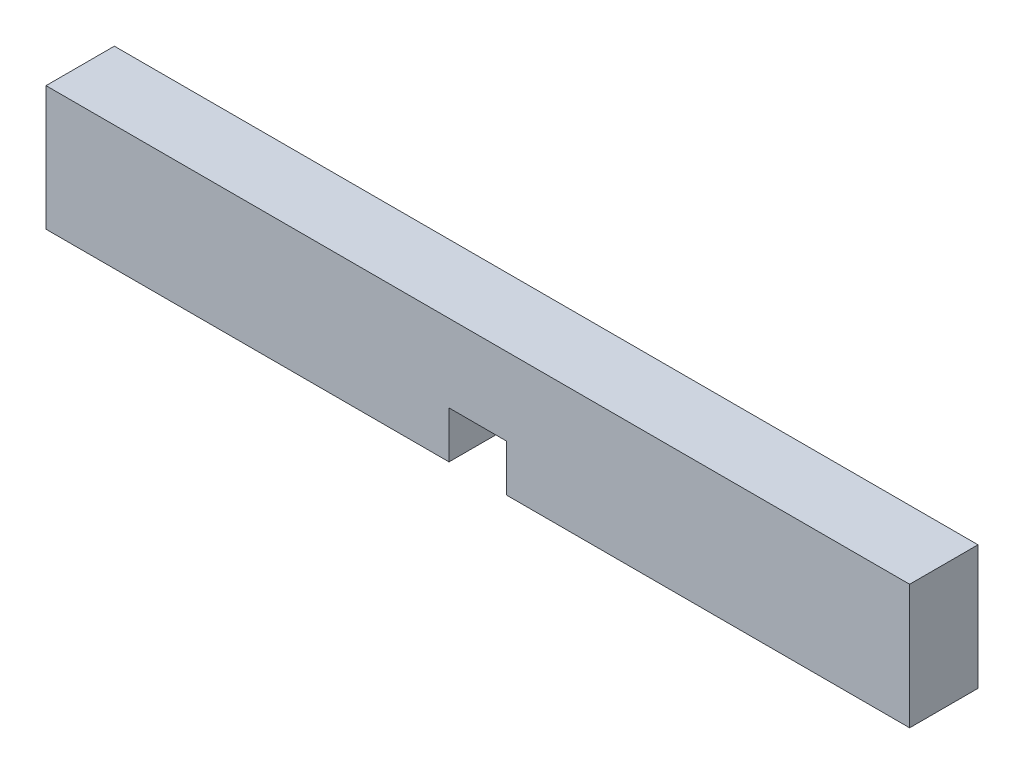
ISO-10303-21;
HEADER;
FILE_DESCRIPTION(('STEP AP214'),'2;1');
FILE_NAME('part.step','',(''),(''),'','','');
FILE_SCHEMA(('AUTOMOTIVE_DESIGN { 1 0 10303 214 1 1 1 1 }'));
ENDSEC;
DATA;
#1=APPLICATION_CONTEXT('core data for automotive mechanical design processes');
#2=APPLICATION_PROTOCOL_DEFINITION('international standard','automotive_design',2000,#1);
#3=PRODUCT_CONTEXT('',#1,'mechanical');
#4=PRODUCT('Part','Part','',(#3));
#5=PRODUCT_RELATED_PRODUCT_CATEGORY('part','',(#4));
#6=PRODUCT_DEFINITION_FORMATION('','',#4);
#7=PRODUCT_DEFINITION_CONTEXT('part definition',#1,'design');
#8=PRODUCT_DEFINITION('design','',#6,#7);
#9=PRODUCT_DEFINITION_SHAPE('','',#8);
#10=(LENGTH_UNIT() NAMED_UNIT(*) SI_UNIT(.MILLI.,.METRE.));
#11=(NAMED_UNIT(*) PLANE_ANGLE_UNIT() SI_UNIT($,.RADIAN.));
#12=(NAMED_UNIT(*) SI_UNIT($,.STERADIAN.) SOLID_ANGLE_UNIT());
#13=UNCERTAINTY_MEASURE_WITH_UNIT(LENGTH_MEASURE(1.E-05),#10,'distance_accuracy_value','');
#14=(GEOMETRIC_REPRESENTATION_CONTEXT(3) GLOBAL_UNCERTAINTY_ASSIGNED_CONTEXT((#13)) GLOBAL_UNIT_ASSIGNED_CONTEXT((#10,
#11,#12)) REPRESENTATION_CONTEXT('',''));
#15=CARTESIAN_POINT('',(0.,0.,0.));
#16=DIRECTION('',(0.,0.,1.));
#17=DIRECTION('',(1.,0.,0.));
#18=AXIS2_PLACEMENT_3D('',#15,#16,#17);
#19=CARTESIAN_POINT('',(0.,-1.07,2.375));
#20=DIRECTION('',(0.,1.,0.));
#21=DIRECTION('',(0.,0.,1.));
#22=AXIS2_PLACEMENT_3D('',#19,#20,#21);
#23=PLANE('',#22);
#24=DIRECTION('',(1.,0.,0.));
#25=VECTOR('',#24,1.);
#26=CARTESIAN_POINT('',(0.,-1.07,-2.375));
#27=LINE('',#26,#25);
#28=CARTESIAN_POINT('',(-2.,-1.07,-2.375));
#29=VERTEX_POINT('',#28);
#30=CARTESIAN_POINT('',(2.,-1.07,-2.375));
#31=VERTEX_POINT('',#30);
#32=EDGE_CURVE('E134',#29,#31,#27,.T.);
#33=ORIENTED_EDGE('',*,*,#32,.T.);
#34=DIRECTION('',(0.,0.,-1.));
#35=VECTOR('',#34,1.);
#36=CARTESIAN_POINT('',(2.,-1.07,2.375));
#37=LINE('',#36,#35);
#38=CARTESIAN_POINT('',(2.,-1.07,2.375));
#39=VERTEX_POINT('',#38);
#40=EDGE_CURVE('E11',#39,#31,#37,.T.);
#41=ORIENTED_EDGE('',*,*,#40,.F.);
#42=DIRECTION('',(1.,0.,0.));
#43=VECTOR('',#42,1.);
#44=CARTESIAN_POINT('',(0.,-1.07,2.375));
#45=LINE('',#44,#43);
#46=CARTESIAN_POINT('',(-2.,-1.07,2.375));
#47=VERTEX_POINT('',#46);
#48=EDGE_CURVE('E151',#47,#39,#45,.T.);
#49=ORIENTED_EDGE('',*,*,#48,.F.);
#50=DIRECTION('',(0.,0.,-1.));
#51=VECTOR('',#50,1.);
#52=CARTESIAN_POINT('',(-2.,-1.07,2.375));
#53=LINE('',#52,#51);
#54=EDGE_CURVE('E51',#47,#29,#53,.T.);
#55=ORIENTED_EDGE('',*,*,#54,.T.);
#56=EDGE_LOOP('',(#33,#41,#49,#55));
#57=FACE_BOUND('',#56,.T.);
#58=ADVANCED_FACE('F35',(#57),#23,.F.);
#59=CARTESIAN_POINT('',(2.,0.,2.375));
#60=DIRECTION('',(1.,0.,0.));
#61=DIRECTION('',(0.,0.,-1.));
#62=AXIS2_PLACEMENT_3D('',#59,#60,#61);
#63=PLANE('',#62);
#64=DIRECTION('',(0.,-1.,0.));
#65=VECTOR('',#64,1.);
#66=CARTESIAN_POINT('',(2.,0.,-2.375));
#67=LINE('',#66,#65);
#68=CARTESIAN_POINT('',(2.,-4.32,-2.375));
#69=VERTEX_POINT('',#68);
#70=EDGE_CURVE('E136',#31,#69,#67,.T.);
#71=ORIENTED_EDGE('',*,*,#70,.T.);
#72=DIRECTION('',(0.,0.,-1.));
#73=VECTOR('',#72,1.);
#74=CARTESIAN_POINT('',(2.,-4.32,2.375));
#75=LINE('',#74,#73);
#76=CARTESIAN_POINT('',(2.,-4.32,2.375));
#77=VERTEX_POINT('',#76);
#78=EDGE_CURVE('E43',#77,#69,#75,.T.);
#79=ORIENTED_EDGE('',*,*,#78,.F.);
#80=DIRECTION('',(0.,-1.,0.));
#81=VECTOR('',#80,1.);
#82=CARTESIAN_POINT('',(2.,0.,2.375));
#83=LINE('',#82,#81);
#84=EDGE_CURVE('E90',#39,#77,#83,.T.);
#85=ORIENTED_EDGE('',*,*,#84,.F.);
#86=ORIENTED_EDGE('',*,*,#40,.T.);
#87=EDGE_LOOP('',(#71,#79,#85,#86));
#88=FACE_BOUND('',#87,.T.);
#89=ADVANCED_FACE('F176',(#88),#63,.F.);
#90=CARTESIAN_POINT('',(0.,-4.32,2.375));
#91=DIRECTION('',(0.,1.,0.));
#92=DIRECTION('',(0.,0.,1.));
#93=AXIS2_PLACEMENT_3D('',#90,#91,#92);
#94=PLANE('',#93);
#95=DIRECTION('',(1.,0.,0.));
#96=VECTOR('',#95,1.);
#97=CARTESIAN_POINT('',(0.,-4.32,-2.375));
#98=LINE('',#97,#96);
#99=CARTESIAN_POINT('',(30.,-4.32,-2.375));
#100=VERTEX_POINT('',#99);
#101=EDGE_CURVE('E138',#69,#100,#98,.T.);
#102=ORIENTED_EDGE('',*,*,#101,.T.);
#103=DIRECTION('',(0.,0.,-1.));
#104=VECTOR('',#103,1.);
#105=CARTESIAN_POINT('',(30.,-4.32,2.375));
#106=LINE('',#105,#104);
#107=CARTESIAN_POINT('',(30.,-4.32,2.375));
#108=VERTEX_POINT('',#107);
#109=EDGE_CURVE('E157',#108,#100,#106,.T.);
#110=ORIENTED_EDGE('',*,*,#109,.F.);
#111=DIRECTION('',(1.,0.,0.));
#112=VECTOR('',#111,1.);
#113=CARTESIAN_POINT('',(0.,-4.32,2.375));
#114=LINE('',#113,#112);
#115=EDGE_CURVE('E123',#77,#108,#114,.T.);
#116=ORIENTED_EDGE('',*,*,#115,.F.);
#117=ORIENTED_EDGE('',*,*,#78,.T.);
#118=EDGE_LOOP('',(#102,#110,#116,#117));
#119=FACE_BOUND('',#118,.T.);
#120=ADVANCED_FACE('F163',(#119),#94,.F.);
#121=CARTESIAN_POINT('',(30.,0.,2.375));
#122=DIRECTION('',(-1.,0.,0.));
#123=DIRECTION('',(0.,0.,1.));
#124=AXIS2_PLACEMENT_3D('',#121,#122,#123);
#125=PLANE('',#124);
#126=DIRECTION('',(0.,1.,0.));
#127=VECTOR('',#126,1.);
#128=CARTESIAN_POINT('',(30.,0.,-2.375));
#129=LINE('',#128,#127);
#130=CARTESIAN_POINT('',(30.,4.32,-2.375));
#131=VERTEX_POINT('',#130);
#132=EDGE_CURVE('E140',#100,#131,#129,.T.);
#133=ORIENTED_EDGE('',*,*,#132,.T.);
#134=DIRECTION('',(0.,0.,-1.));
#135=VECTOR('',#134,1.);
#136=CARTESIAN_POINT('',(30.,4.32,2.375));
#137=LINE('',#136,#135);
#138=CARTESIAN_POINT('',(30.,4.32,2.375));
#139=VERTEX_POINT('',#138);
#140=EDGE_CURVE('E155',#139,#131,#137,.T.);
#141=ORIENTED_EDGE('',*,*,#140,.F.);
#142=DIRECTION('',(0.,1.,0.));
#143=VECTOR('',#142,1.);
#144=CARTESIAN_POINT('',(30.,0.,2.375));
#145=LINE('',#144,#143);
#146=EDGE_CURVE('E129',#108,#139,#145,.T.);
#147=ORIENTED_EDGE('',*,*,#146,.F.);
#148=ORIENTED_EDGE('',*,*,#109,.T.);
#149=EDGE_LOOP('',(#133,#141,#147,#148));
#150=FACE_BOUND('',#149,.T.);
#151=ADVANCED_FACE('F171',(#150),#125,.F.);
#152=CARTESIAN_POINT('',(0.,4.32,2.375));
#153=DIRECTION('',(0.,1.,0.));
#154=DIRECTION('',(0.,0.,1.));
#155=AXIS2_PLACEMENT_3D('',#152,#153,#154);
#156=PLANE('',#155);
#157=DIRECTION('',(1.,0.,0.));
#158=VECTOR('',#157,1.);
#159=CARTESIAN_POINT('',(0.,4.32,-2.375));
#160=LINE('',#159,#158);
#161=CARTESIAN_POINT('',(-30.,4.32,-2.375));
#162=VERTEX_POINT('',#161);
#163=EDGE_CURVE('E144',#162,#131,#160,.T.);
#164=ORIENTED_EDGE('',*,*,#163,.F.);
#165=DIRECTION('',(0.,0.,-1.));
#166=VECTOR('',#165,1.);
#167=CARTESIAN_POINT('',(-30.,4.32,2.375));
#168=LINE('',#167,#166);
#169=CARTESIAN_POINT('',(-30.,4.32,2.375));
#170=VERTEX_POINT('',#169);
#171=EDGE_CURVE('E115',#170,#162,#168,.T.);
#172=ORIENTED_EDGE('',*,*,#171,.F.);
#173=DIRECTION('',(1.,0.,0.));
#174=VECTOR('',#173,1.);
#175=CARTESIAN_POINT('',(0.,4.32,2.375));
#176=LINE('',#175,#174);
#177=EDGE_CURVE('E127',#170,#139,#176,.T.);
#178=ORIENTED_EDGE('',*,*,#177,.T.);
#179=ORIENTED_EDGE('',*,*,#140,.T.);
#180=EDGE_LOOP('',(#164,#172,#178,#179));
#181=FACE_BOUND('',#180,.T.);
#182=ADVANCED_FACE('F186',(#181),#156,.T.);
#183=CARTESIAN_POINT('',(-30.,0.,2.375));
#184=DIRECTION('',(-1.,0.,0.));
#185=DIRECTION('',(0.,0.,1.));
#186=AXIS2_PLACEMENT_3D('',#183,#184,#185);
#187=PLANE('',#186);
#188=DIRECTION('',(0.,1.,0.));
#189=VECTOR('',#188,1.);
#190=CARTESIAN_POINT('',(-30.,0.,-2.375));
#191=LINE('',#190,#189);
#192=CARTESIAN_POINT('',(-30.,-4.32,-2.375));
#193=VERTEX_POINT('',#192);
#194=EDGE_CURVE('E112',#193,#162,#191,.T.);
#195=ORIENTED_EDGE('',*,*,#194,.F.);
#196=DIRECTION('',(0.,0.,-1.));
#197=VECTOR('',#196,1.);
#198=CARTESIAN_POINT('',(-30.,-4.32,2.375));
#199=LINE('',#198,#197);
#200=CARTESIAN_POINT('',(-30.,-4.32,2.375));
#201=VERTEX_POINT('',#200);
#202=EDGE_CURVE('E106',#201,#193,#199,.T.);
#203=ORIENTED_EDGE('',*,*,#202,.F.);
#204=DIRECTION('',(0.,1.,0.));
#205=VECTOR('',#204,1.);
#206=CARTESIAN_POINT('',(-30.,0.,2.375));
#207=LINE('',#206,#205);
#208=EDGE_CURVE('E110',#201,#170,#207,.T.);
#209=ORIENTED_EDGE('',*,*,#208,.T.);
#210=ORIENTED_EDGE('',*,*,#171,.T.);
#211=EDGE_LOOP('',(#195,#203,#209,#210));
#212=FACE_BOUND('',#211,.T.);
#213=ADVANCED_FACE('F108',(#212),#187,.T.);
#214=CARTESIAN_POINT('',(-2.,-4.32,-2.375));
#215=VERTEX_POINT('',#214);
#216=EDGE_CURVE('E141',#193,#215,#98,.T.);
#217=ORIENTED_EDGE('',*,*,#216,.T.);
#218=DIRECTION('',(0.,0.,-1.));
#219=VECTOR('',#218,1.);
#220=CARTESIAN_POINT('',(-2.,-4.32,2.375));
#221=LINE('',#220,#219);
#222=CARTESIAN_POINT('',(-2.,-4.32,2.375));
#223=VERTEX_POINT('',#222);
#224=EDGE_CURVE('E78',#223,#215,#221,.T.);
#225=ORIENTED_EDGE('',*,*,#224,.F.);
#226=EDGE_CURVE('E117',#201,#223,#114,.T.);
#227=ORIENTED_EDGE('',*,*,#226,.F.);
#228=ORIENTED_EDGE('',*,*,#202,.T.);
#229=EDGE_LOOP('',(#217,#225,#227,#228));
#230=FACE_BOUND('',#229,.T.);
#231=ADVANCED_FACE('F118',(#230),#94,.F.);
#232=CARTESIAN_POINT('',(-2.,0.,2.375));
#233=DIRECTION('',(1.,0.,0.));
#234=DIRECTION('',(0.,0.,-1.));
#235=AXIS2_PLACEMENT_3D('',#232,#233,#234);
#236=PLANE('',#235);
#237=DIRECTION('',(0.,-1.,0.));
#238=VECTOR('',#237,1.);
#239=CARTESIAN_POINT('',(-2.,0.,-2.375));
#240=LINE('',#239,#238);
#241=EDGE_CURVE('E148',#29,#215,#240,.T.);
#242=ORIENTED_EDGE('',*,*,#241,.F.);
#243=ORIENTED_EDGE('',*,*,#54,.F.);
#244=DIRECTION('',(0.,-1.,0.));
#245=VECTOR('',#244,1.);
#246=CARTESIAN_POINT('',(-2.,0.,2.375));
#247=LINE('',#246,#245);
#248=EDGE_CURVE('E121',#47,#223,#247,.T.);
#249=ORIENTED_EDGE('',*,*,#248,.T.);
#250=ORIENTED_EDGE('',*,*,#224,.T.);
#251=EDGE_LOOP('',(#242,#243,#249,#250));
#252=FACE_BOUND('',#251,.T.);
#253=ADVANCED_FACE('F193',(#252),#236,.T.);
#254=CARTESIAN_POINT('',(0.,0.,2.375));
#255=DIRECTION('',(0.,0.,1.));
#256=DIRECTION('',(1.,0.,0.));
#257=AXIS2_PLACEMENT_3D('',#254,#255,#256);
#258=PLANE('',#257);
#259=ORIENTED_EDGE('',*,*,#48,.T.);
#260=ORIENTED_EDGE('',*,*,#84,.T.);
#261=ORIENTED_EDGE('',*,*,#115,.T.);
#262=ORIENTED_EDGE('',*,*,#146,.T.);
#263=ORIENTED_EDGE('',*,*,#177,.F.);
#264=ORIENTED_EDGE('',*,*,#208,.F.);
#265=ORIENTED_EDGE('',*,*,#226,.T.);
#266=ORIENTED_EDGE('',*,*,#248,.F.);
#267=EDGE_LOOP('',(#259,#260,#261,#262,#263,#264,#265,#266));
#268=FACE_BOUND('',#267,.T.);
#269=ADVANCED_FACE('F125',(#268),#258,.T.);
#270=CARTESIAN_POINT('',(0.,0.,-2.375));
#271=DIRECTION('',(0.,0.,1.));
#272=DIRECTION('',(1.,0.,0.));
#273=AXIS2_PLACEMENT_3D('',#270,#271,#272);
#274=PLANE('',#273);
#275=ORIENTED_EDGE('',*,*,#32,.F.);
#276=ORIENTED_EDGE('',*,*,#241,.T.);
#277=ORIENTED_EDGE('',*,*,#216,.F.);
#278=ORIENTED_EDGE('',*,*,#194,.T.);
#279=ORIENTED_EDGE('',*,*,#163,.T.);
#280=ORIENTED_EDGE('',*,*,#132,.F.);
#281=ORIENTED_EDGE('',*,*,#101,.F.);
#282=ORIENTED_EDGE('',*,*,#70,.F.);
#283=EDGE_LOOP('',(#275,#276,#277,#278,#279,#280,#281,#282));
#284=FACE_BOUND('',#283,.T.);
#285=ADVANCED_FACE('F167',(#284),#274,.F.);
#286=CLOSED_SHELL('',(#58,#89,#120,#151,#182,#213,#231,#253,#269,#285));
#287=MANIFOLD_SOLID_BREP('B2',#286);
#288=ADVANCED_BREP_SHAPE_REPRESENTATION('',(#18,#287),#14);
#289=SHAPE_DEFINITION_REPRESENTATION(#9,#288);
ENDSEC;
END-ISO-10303-21;
